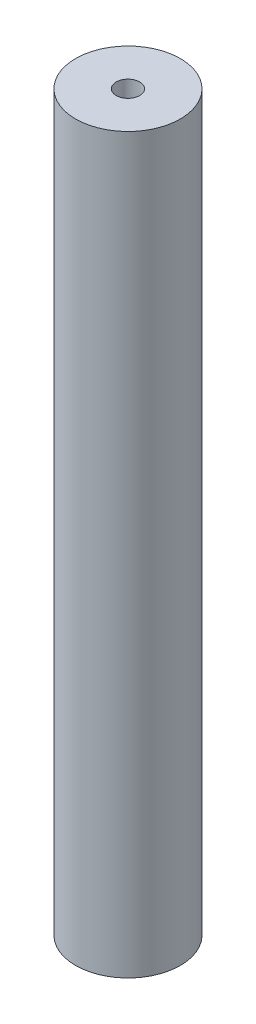
ISO-10303-21;
HEADER;
FILE_DESCRIPTION(('STEP AP214'),'2;1');
FILE_NAME('part.step','',(''),(''),'','','');
FILE_SCHEMA(('AUTOMOTIVE_DESIGN { 1 0 10303 214 1 1 1 1 }'));
ENDSEC;
DATA;
#1=APPLICATION_CONTEXT('core data for automotive mechanical design processes');
#2=APPLICATION_PROTOCOL_DEFINITION('international standard','automotive_design',2000,#1);
#3=PRODUCT_CONTEXT('',#1,'mechanical');
#4=PRODUCT('Part','Part','',(#3));
#5=PRODUCT_RELATED_PRODUCT_CATEGORY('part','',(#4));
#6=PRODUCT_DEFINITION_FORMATION('','',#4);
#7=PRODUCT_DEFINITION_CONTEXT('part definition',#1,'design');
#8=PRODUCT_DEFINITION('design','',#6,#7);
#9=PRODUCT_DEFINITION_SHAPE('','',#8);
#10=(LENGTH_UNIT() NAMED_UNIT(*) SI_UNIT(.MILLI.,.METRE.));
#11=(NAMED_UNIT(*) PLANE_ANGLE_UNIT() SI_UNIT($,.RADIAN.));
#12=(NAMED_UNIT(*) SI_UNIT($,.STERADIAN.) SOLID_ANGLE_UNIT());
#13=UNCERTAINTY_MEASURE_WITH_UNIT(LENGTH_MEASURE(1.E-05),#10,'distance_accuracy_value','');
#14=(GEOMETRIC_REPRESENTATION_CONTEXT(3) GLOBAL_UNCERTAINTY_ASSIGNED_CONTEXT((#13)) GLOBAL_UNIT_ASSIGNED_CONTEXT((#10,
#11,#12)) REPRESENTATION_CONTEXT('',''));
#15=CARTESIAN_POINT('',(0.,0.,0.));
#16=DIRECTION('',(0.,0.,1.));
#17=DIRECTION('',(1.,0.,0.));
#18=AXIS2_PLACEMENT_3D('',#15,#16,#17);
#19=CARTESIAN_POINT('',(0.,70.,0.));
#20=DIRECTION('',(0.,-1.,0.));
#21=DIRECTION('',(0.,0.,-1.));
#22=AXIS2_PLACEMENT_3D('',#19,#20,#21);
#23=CYLINDRICAL_SURFACE('',#22,10.);
#24=CARTESIAN_POINT('',(0.,70.,0.));
#25=DIRECTION('',(0.,1.,0.));
#26=DIRECTION('',(0.,0.,1.));
#27=AXIS2_PLACEMENT_3D('',#24,#25,#26);
#28=CIRCLE('',#27,10.);
#29=CARTESIAN_POINT('',(0.,70.,10.));
#30=VERTEX_POINT('',#29);
#31=EDGE_CURVE('E11',#30,#30,#28,.T.);
#32=ORIENTED_EDGE('',*,*,#31,.F.);
#33=EDGE_LOOP('',(#32));
#34=FACE_BOUND('',#33,.T.);
#35=CARTESIAN_POINT('',(0.,-70.,0.));
#36=DIRECTION('',(0.,1.,0.));
#37=DIRECTION('',(0.,0.,1.));
#38=AXIS2_PLACEMENT_3D('',#35,#36,#37);
#39=CIRCLE('',#38,10.);
#40=CARTESIAN_POINT('',(0.,-70.,10.));
#41=VERTEX_POINT('',#40);
#42=EDGE_CURVE('E62',#41,#41,#39,.T.);
#43=ORIENTED_EDGE('',*,*,#42,.T.);
#44=EDGE_LOOP('',(#43));
#45=FACE_BOUND('',#44,.T.);
#46=ADVANCED_FACE('F39',(#34,#45),#23,.T.);
#47=CARTESIAN_POINT('',(0.,70.,0.));
#48=DIRECTION('',(0.,1.,0.));
#49=DIRECTION('',(0.,0.,1.));
#50=AXIS2_PLACEMENT_3D('',#47,#48,#49);
#51=PLANE('',#50);
#52=CARTESIAN_POINT('',(0.,70.,0.));
#53=DIRECTION('',(0.,1.,0.));
#54=DIRECTION('',(0.,0.,1.));
#55=AXIS2_PLACEMENT_3D('',#52,#53,#54);
#56=CIRCLE('',#55,2.24999999999999);
#57=CARTESIAN_POINT('',(0.,70.,2.24999999999999));
#58=VERTEX_POINT('',#57);
#59=EDGE_CURVE('E66',#58,#58,#56,.T.);
#60=ORIENTED_EDGE('',*,*,#59,.F.);
#61=EDGE_LOOP('',(#60));
#62=FACE_BOUND('',#61,.T.);
#63=ORIENTED_EDGE('',*,*,#31,.T.);
#64=EDGE_LOOP('',(#63));
#65=FACE_BOUND('',#64,.T.);
#66=ADVANCED_FACE('F83',(#62,#65),#51,.T.);
#67=CARTESIAN_POINT('',(0.,54.,0.));
#68=DIRECTION('',(0.,1.,0.));
#69=DIRECTION('',(0.,0.,1.));
#70=AXIS2_PLACEMENT_3D('',#67,#68,#69);
#71=CONICAL_SURFACE('',#70,2.24999999999999,1.02974425867665);
#72=CARTESIAN_POINT('',(0.,52.648063607188,0.));
#73=VERTEX_POINT('',#72);
#74=VERTEX_LOOP('',#73);
#75=FACE_BOUND('',#74,.T.);
#76=CARTESIAN_POINT('',(0.,54.,0.));
#77=DIRECTION('',(0.,1.,0.));
#78=DIRECTION('',(0.,0.,1.));
#79=AXIS2_PLACEMENT_3D('',#76,#77,#78);
#80=CIRCLE('',#79,2.24999999999999);
#81=CARTESIAN_POINT('',(0.,54.,2.24999999999999));
#82=VERTEX_POINT('',#81);
#83=EDGE_CURVE('E46',#82,#82,#80,.T.);
#84=ORIENTED_EDGE('',*,*,#83,.T.);
#85=EDGE_LOOP('',(#84));
#86=FACE_BOUND('',#85,.T.);
#87=ADVANCED_FACE('F75',(#75,#86),#71,.F.);
#88=CARTESIAN_POINT('',(0.,70.,0.));
#89=DIRECTION('',(0.,1.,0.));
#90=DIRECTION('',(0.,0.,1.));
#91=AXIS2_PLACEMENT_3D('',#88,#89,#90);
#92=CYLINDRICAL_SURFACE('',#91,2.24999999999999);
#93=ORIENTED_EDGE('',*,*,#83,.F.);
#94=EDGE_LOOP('',(#93));
#95=FACE_BOUND('',#94,.T.);
#96=ORIENTED_EDGE('',*,*,#59,.T.);
#97=EDGE_LOOP('',(#96));
#98=FACE_BOUND('',#97,.T.);
#99=ADVANCED_FACE('F77',(#95,#98),#92,.F.);
#100=CARTESIAN_POINT('',(0.,-70.,0.));
#101=DIRECTION('',(0.,-1.,0.));
#102=DIRECTION('',(0.,0.,1.));
#103=AXIS2_PLACEMENT_3D('',#100,#101,#102);
#104=PLANE('',#103);
#105=CARTESIAN_POINT('',(0.,-70.,0.));
#106=DIRECTION('',(0.,-1.,0.));
#107=DIRECTION('',(0.,0.,-1.));
#108=AXIS2_PLACEMENT_3D('',#105,#106,#107);
#109=CIRCLE('',#108,2.24999999999999);
#110=CARTESIAN_POINT('',(0.,-70.,-2.24999999999999));
#111=VERTEX_POINT('',#110);
#112=EDGE_CURVE('E63',#111,#111,#109,.T.);
#113=ORIENTED_EDGE('',*,*,#112,.F.);
#114=EDGE_LOOP('',(#113));
#115=FACE_BOUND('',#114,.T.);
#116=ORIENTED_EDGE('',*,*,#42,.F.);
#117=EDGE_LOOP('',(#116));
#118=FACE_BOUND('',#117,.T.);
#119=ADVANCED_FACE('F56',(#115,#118),#104,.T.);
#120=CARTESIAN_POINT('',(0.,-54.,0.));
#121=DIRECTION('',(0.,-1.,0.));
#122=DIRECTION('',(0.,0.,-1.));
#123=AXIS2_PLACEMENT_3D('',#120,#121,#122);
#124=CONICAL_SURFACE('',#123,2.24999999999999,1.02974425867665);
#125=CARTESIAN_POINT('',(0.,-52.648063607188,0.));
#126=VERTEX_POINT('',#125);
#127=VERTEX_LOOP('',#126);
#128=FACE_BOUND('',#127,.T.);
#129=CARTESIAN_POINT('',(0.,-54.,0.));
#130=DIRECTION('',(0.,-1.,0.));
#131=DIRECTION('',(0.,0.,-1.));
#132=AXIS2_PLACEMENT_3D('',#129,#130,#131);
#133=CIRCLE('',#132,2.24999999999999);
#134=CARTESIAN_POINT('',(0.,-54.,-2.24999999999999));
#135=VERTEX_POINT('',#134);
#136=EDGE_CURVE('E60',#135,#135,#133,.T.);
#137=ORIENTED_EDGE('',*,*,#136,.T.);
#138=EDGE_LOOP('',(#137));
#139=FACE_BOUND('',#138,.T.);
#140=ADVANCED_FACE('F52',(#128,#139),#124,.F.);
#141=CARTESIAN_POINT('',(0.,-70.,0.));
#142=DIRECTION('',(0.,-1.,0.));
#143=DIRECTION('',(0.,0.,-1.));
#144=AXIS2_PLACEMENT_3D('',#141,#142,#143);
#145=CYLINDRICAL_SURFACE('',#144,2.24999999999999);
#146=ORIENTED_EDGE('',*,*,#136,.F.);
#147=EDGE_LOOP('',(#146));
#148=FACE_BOUND('',#147,.T.);
#149=ORIENTED_EDGE('',*,*,#112,.T.);
#150=EDGE_LOOP('',(#149));
#151=FACE_BOUND('',#150,.T.);
#152=ADVANCED_FACE('F55',(#148,#151),#145,.F.);
#153=CLOSED_SHELL('',(#46,#66,#87,#99,#119,#140,#152));
#154=MANIFOLD_SOLID_BREP('B2',#153);
#155=ADVANCED_BREP_SHAPE_REPRESENTATION('',(#18,#154),#14);
#156=SHAPE_DEFINITION_REPRESENTATION(#9,#155);
ENDSEC;
END-ISO-10303-21;
